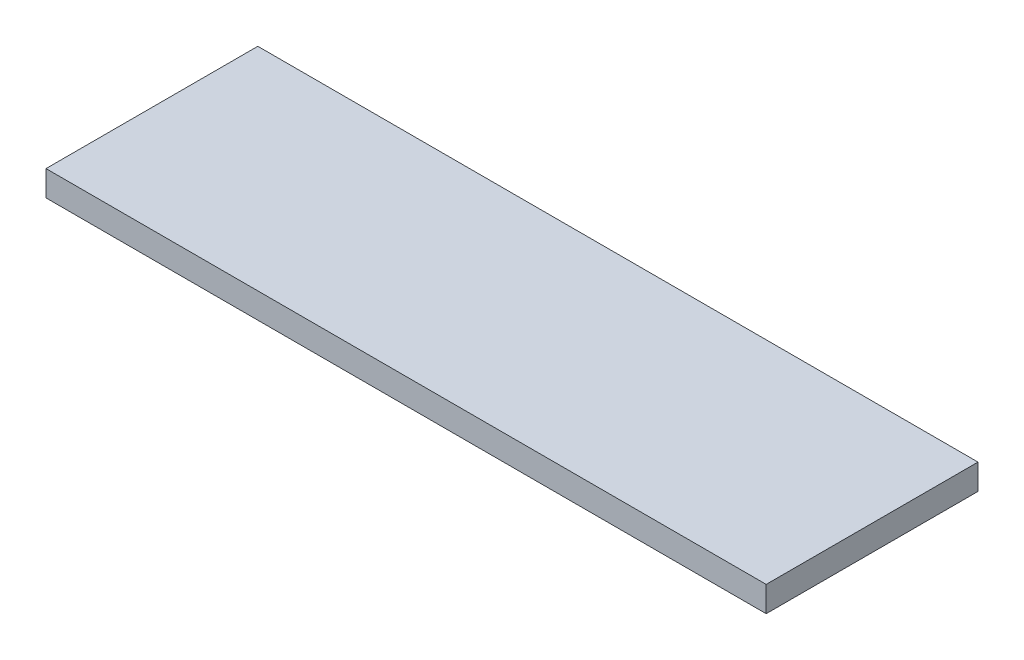
ISO-10303-21;
HEADER;
FILE_DESCRIPTION(('STEP AP214'),'2;1');
FILE_NAME('part.step','',(''),(''),'','','');
FILE_SCHEMA(('AUTOMOTIVE_DESIGN { 1 0 10303 214 1 1 1 1 }'));
ENDSEC;
DATA;
#1=APPLICATION_CONTEXT('core data for automotive mechanical design processes');
#2=APPLICATION_PROTOCOL_DEFINITION('international standard','automotive_design',2000,#1);
#3=PRODUCT_CONTEXT('',#1,'mechanical');
#4=PRODUCT('Part','Part','',(#3));
#5=PRODUCT_RELATED_PRODUCT_CATEGORY('part','',(#4));
#6=PRODUCT_DEFINITION_FORMATION('','',#4);
#7=PRODUCT_DEFINITION_CONTEXT('part definition',#1,'design');
#8=PRODUCT_DEFINITION('design','',#6,#7);
#9=PRODUCT_DEFINITION_SHAPE('','',#8);
#10=(LENGTH_UNIT() NAMED_UNIT(*) SI_UNIT(.MILLI.,.METRE.));
#11=(NAMED_UNIT(*) PLANE_ANGLE_UNIT() SI_UNIT($,.RADIAN.));
#12=(NAMED_UNIT(*) SI_UNIT($,.STERADIAN.) SOLID_ANGLE_UNIT());
#13=UNCERTAINTY_MEASURE_WITH_UNIT(LENGTH_MEASURE(1.E-05),#10,'distance_accuracy_value','');
#14=(GEOMETRIC_REPRESENTATION_CONTEXT(3) GLOBAL_UNCERTAINTY_ASSIGNED_CONTEXT((#13)) GLOBAL_UNIT_ASSIGNED_CONTEXT((#10,
#11,#12)) REPRESENTATION_CONTEXT('',''));
#15=CARTESIAN_POINT('',(0.,0.,0.));
#16=DIRECTION('',(0.,0.,1.));
#17=DIRECTION('',(1.,0.,0.));
#18=AXIS2_PLACEMENT_3D('',#15,#16,#17);
#19=CARTESIAN_POINT('',(0.,0.,25.));
#20=DIRECTION('',(1.,0.,0.));
#21=DIRECTION('',(0.,0.,-1.));
#22=AXIS2_PLACEMENT_3D('',#19,#20,#21);
#23=PLANE('',#22);
#24=DIRECTION('',(0.,-1.,0.));
#25=VECTOR('',#24,1.);
#26=CARTESIAN_POINT('',(0.,0.,0.));
#27=LINE('',#26,#25);
#28=CARTESIAN_POINT('',(0.,3.,0.));
#29=VERTEX_POINT('',#28);
#30=CARTESIAN_POINT('',(0.,0.,0.));
#31=VERTEX_POINT('',#30);
#32=EDGE_CURVE('E96',#29,#31,#27,.T.);
#33=ORIENTED_EDGE('',*,*,#32,.T.);
#34=DIRECTION('',(0.,0.,-1.));
#35=VECTOR('',#34,1.);
#36=CARTESIAN_POINT('',(0.,0.,25.));
#37=LINE('',#36,#35);
#38=CARTESIAN_POINT('',(0.,0.,25.));
#39=VERTEX_POINT('',#38);
#40=EDGE_CURVE('E11',#39,#31,#37,.T.);
#41=ORIENTED_EDGE('',*,*,#40,.F.);
#42=DIRECTION('',(0.,-1.,0.));
#43=VECTOR('',#42,1.);
#44=CARTESIAN_POINT('',(0.,0.,25.));
#45=LINE('',#44,#43);
#46=CARTESIAN_POINT('',(0.,3.,25.));
#47=VERTEX_POINT('',#46);
#48=EDGE_CURVE('E84',#47,#39,#45,.T.);
#49=ORIENTED_EDGE('',*,*,#48,.F.);
#50=DIRECTION('',(0.,0.,-1.));
#51=VECTOR('',#50,1.);
#52=CARTESIAN_POINT('',(0.,3.,25.));
#53=LINE('',#52,#51);
#54=EDGE_CURVE('E92',#47,#29,#53,.T.);
#55=ORIENTED_EDGE('',*,*,#54,.T.);
#56=EDGE_LOOP('',(#33,#41,#49,#55));
#57=FACE_BOUND('',#56,.T.);
#58=ADVANCED_FACE('F33',(#57),#23,.F.);
#59=CARTESIAN_POINT('',(0.,0.,25.));
#60=DIRECTION('',(0.,1.,0.));
#61=DIRECTION('',(0.,0.,1.));
#62=AXIS2_PLACEMENT_3D('',#59,#60,#61);
#63=PLANE('',#62);
#64=DIRECTION('',(1.,0.,0.));
#65=VECTOR('',#64,1.);
#66=CARTESIAN_POINT('',(0.,0.,0.));
#67=LINE('',#66,#65);
#68=CARTESIAN_POINT('',(85.,0.,0.));
#69=VERTEX_POINT('',#68);
#70=EDGE_CURVE('E88',#31,#69,#67,.T.);
#71=ORIENTED_EDGE('',*,*,#70,.T.);
#72=DIRECTION('',(0.,0.,-1.));
#73=VECTOR('',#72,1.);
#74=CARTESIAN_POINT('',(85.,0.,25.));
#75=LINE('',#74,#73);
#76=CARTESIAN_POINT('',(85.,0.,25.));
#77=VERTEX_POINT('',#76);
#78=EDGE_CURVE('E41',#77,#69,#75,.T.);
#79=ORIENTED_EDGE('',*,*,#78,.F.);
#80=DIRECTION('',(1.,0.,0.));
#81=VECTOR('',#80,1.);
#82=CARTESIAN_POINT('',(0.,0.,25.));
#83=LINE('',#82,#81);
#84=EDGE_CURVE('E79',#39,#77,#83,.T.);
#85=ORIENTED_EDGE('',*,*,#84,.F.);
#86=ORIENTED_EDGE('',*,*,#40,.T.);
#87=EDGE_LOOP('',(#71,#79,#85,#86));
#88=FACE_BOUND('',#87,.T.);
#89=ADVANCED_FACE('F87',(#88),#63,.F.);
#90=CARTESIAN_POINT('',(85.,0.,25.));
#91=DIRECTION('',(-1.,0.,0.));
#92=DIRECTION('',(0.,0.,1.));
#93=AXIS2_PLACEMENT_3D('',#90,#91,#92);
#94=PLANE('',#93);
#95=DIRECTION('',(0.,1.,0.));
#96=VECTOR('',#95,1.);
#97=CARTESIAN_POINT('',(85.,0.,0.));
#98=LINE('',#97,#96);
#99=CARTESIAN_POINT('',(85.,3.,0.));
#100=VERTEX_POINT('',#99);
#101=EDGE_CURVE('E66',#69,#100,#98,.T.);
#102=ORIENTED_EDGE('',*,*,#101,.T.);
#103=DIRECTION('',(0.,0.,-1.));
#104=VECTOR('',#103,1.);
#105=CARTESIAN_POINT('',(85.,3.,25.));
#106=LINE('',#105,#104);
#107=CARTESIAN_POINT('',(85.,3.,25.));
#108=VERTEX_POINT('',#107);
#109=EDGE_CURVE('E89',#108,#100,#106,.T.);
#110=ORIENTED_EDGE('',*,*,#109,.F.);
#111=DIRECTION('',(0.,1.,0.));
#112=VECTOR('',#111,1.);
#113=CARTESIAN_POINT('',(85.,0.,25.));
#114=LINE('',#113,#112);
#115=EDGE_CURVE('E82',#77,#108,#114,.T.);
#116=ORIENTED_EDGE('',*,*,#115,.F.);
#117=ORIENTED_EDGE('',*,*,#78,.T.);
#118=EDGE_LOOP('',(#102,#110,#116,#117));
#119=FACE_BOUND('',#118,.T.);
#120=ADVANCED_FACE('F90',(#119),#94,.F.);
#121=CARTESIAN_POINT('',(0.,3.,25.));
#122=DIRECTION('',(0.,-1.,0.));
#123=DIRECTION('',(0.,0.,-1.));
#124=AXIS2_PLACEMENT_3D('',#121,#122,#123);
#125=PLANE('',#124);
#126=DIRECTION('',(-1.,0.,0.));
#127=VECTOR('',#126,1.);
#128=CARTESIAN_POINT('',(0.,3.,0.));
#129=LINE('',#128,#127);
#130=EDGE_CURVE('E72',#100,#29,#129,.T.);
#131=ORIENTED_EDGE('',*,*,#130,.T.);
#132=ORIENTED_EDGE('',*,*,#54,.F.);
#133=DIRECTION('',(-1.,0.,0.));
#134=VECTOR('',#133,1.);
#135=CARTESIAN_POINT('',(0.,3.,25.));
#136=LINE('',#135,#134);
#137=EDGE_CURVE('E49',#108,#47,#136,.T.);
#138=ORIENTED_EDGE('',*,*,#137,.F.);
#139=ORIENTED_EDGE('',*,*,#109,.T.);
#140=EDGE_LOOP('',(#131,#132,#138,#139));
#141=FACE_BOUND('',#140,.T.);
#142=ADVANCED_FACE('F103',(#141),#125,.F.);
#143=CARTESIAN_POINT('',(0.,0.,25.));
#144=DIRECTION('',(0.,0.,-1.));
#145=DIRECTION('',(-1.,0.,0.));
#146=AXIS2_PLACEMENT_3D('',#143,#144,#145);
#147=PLANE('',#146);
#148=ORIENTED_EDGE('',*,*,#48,.T.);
#149=ORIENTED_EDGE('',*,*,#84,.T.);
#150=ORIENTED_EDGE('',*,*,#115,.T.);
#151=ORIENTED_EDGE('',*,*,#137,.T.);
#152=EDGE_LOOP('',(#148,#149,#150,#151));
#153=FACE_BOUND('',#152,.T.);
#154=ADVANCED_FACE('F80',(#153),#147,.F.);
#155=CARTESIAN_POINT('',(0.,0.,0.));
#156=DIRECTION('',(0.,0.,-1.));
#157=DIRECTION('',(-1.,0.,0.));
#158=AXIS2_PLACEMENT_3D('',#155,#156,#157);
#159=PLANE('',#158);
#160=ORIENTED_EDGE('',*,*,#32,.F.);
#161=ORIENTED_EDGE('',*,*,#130,.F.);
#162=ORIENTED_EDGE('',*,*,#101,.F.);
#163=ORIENTED_EDGE('',*,*,#70,.F.);
#164=EDGE_LOOP('',(#160,#161,#162,#163));
#165=FACE_BOUND('',#164,.T.);
#166=ADVANCED_FACE('F106',(#165),#159,.T.);
#167=CLOSED_SHELL('',(#58,#89,#120,#142,#154,#166));
#168=MANIFOLD_SOLID_BREP('B2',#167);
#169=ADVANCED_BREP_SHAPE_REPRESENTATION('',(#18,#168),#14);
#170=SHAPE_DEFINITION_REPRESENTATION(#9,#169);
ENDSEC;
END-ISO-10303-21;
